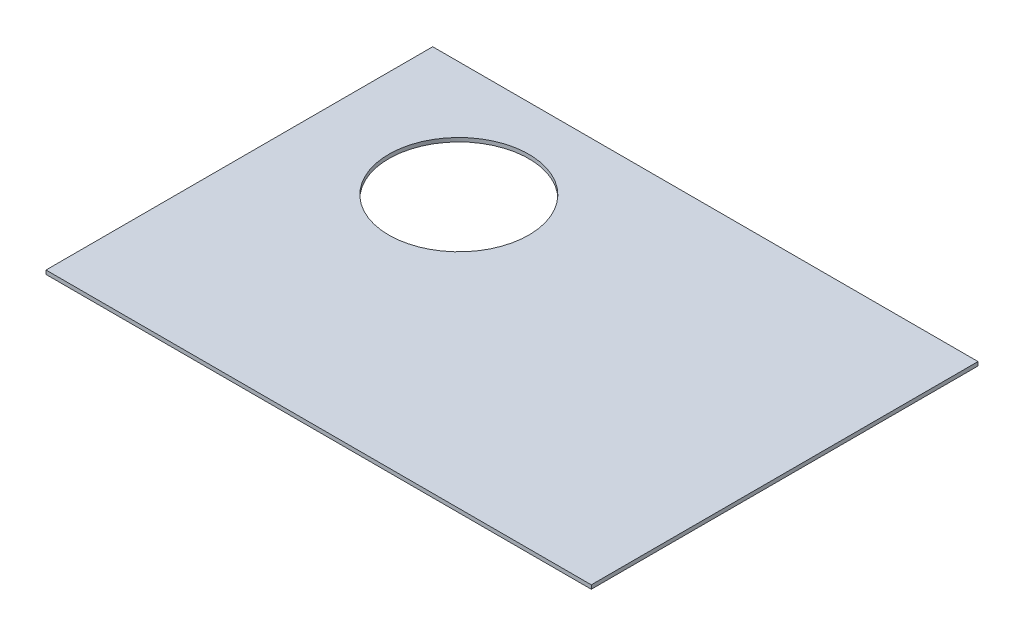
ISO-10303-21;
HEADER;
FILE_DESCRIPTION(('STEP AP214'),'2;1');
FILE_NAME('part.step','',(''),(''),'','','');
FILE_SCHEMA(('AUTOMOTIVE_DESIGN { 1 0 10303 214 1 1 1 1 }'));
ENDSEC;
DATA;
#1=APPLICATION_CONTEXT('core data for automotive mechanical design processes');
#2=APPLICATION_PROTOCOL_DEFINITION('international standard','automotive_design',2000,#1);
#3=PRODUCT_CONTEXT('',#1,'mechanical');
#4=PRODUCT('Part','Part','',(#3));
#5=PRODUCT_RELATED_PRODUCT_CATEGORY('part','',(#4));
#6=PRODUCT_DEFINITION_FORMATION('','',#4);
#7=PRODUCT_DEFINITION_CONTEXT('part definition',#1,'design');
#8=PRODUCT_DEFINITION('design','',#6,#7);
#9=PRODUCT_DEFINITION_SHAPE('','',#8);
#10=(LENGTH_UNIT() NAMED_UNIT(*) SI_UNIT(.MILLI.,.METRE.));
#11=(NAMED_UNIT(*) PLANE_ANGLE_UNIT() SI_UNIT($,.RADIAN.));
#12=(NAMED_UNIT(*) SI_UNIT($,.STERADIAN.) SOLID_ANGLE_UNIT());
#13=UNCERTAINTY_MEASURE_WITH_UNIT(LENGTH_MEASURE(1.E-05),#10,'distance_accuracy_value','');
#14=(GEOMETRIC_REPRESENTATION_CONTEXT(3) GLOBAL_UNCERTAINTY_ASSIGNED_CONTEXT((#13)) GLOBAL_UNIT_ASSIGNED_CONTEXT((#10,
#11,#12)) REPRESENTATION_CONTEXT('',''));
#15=CARTESIAN_POINT('',(0.,0.,0.));
#16=DIRECTION('',(0.,0.,1.));
#17=DIRECTION('',(1.,0.,0.));
#18=AXIS2_PLACEMENT_3D('',#15,#16,#17);
#19=CARTESIAN_POINT('',(0.,3.175,0.));
#20=DIRECTION('',(1.,0.,0.));
#21=DIRECTION('',(0.,0.,-1.));
#22=AXIS2_PLACEMENT_3D('',#19,#20,#21);
#23=PLANE('',#22);
#24=DIRECTION('',(0.,0.,1.));
#25=VECTOR('',#24,1.);
#26=CARTESIAN_POINT('',(0.,0.,0.));
#27=LINE('',#26,#25);
#28=CARTESIAN_POINT('',(0.,0.,-317.5));
#29=VERTEX_POINT('',#28);
#30=CARTESIAN_POINT('',(0.,0.,0.));
#31=VERTEX_POINT('',#30);
#32=EDGE_CURVE('E106',#29,#31,#27,.T.);
#33=ORIENTED_EDGE('',*,*,#32,.T.);
#34=DIRECTION('',(0.,-1.,0.));
#35=VECTOR('',#34,1.);
#36=CARTESIAN_POINT('',(0.,3.175,0.));
#37=LINE('',#36,#35);
#38=CARTESIAN_POINT('',(0.,3.175,0.));
#39=VERTEX_POINT('',#38);
#40=EDGE_CURVE('E11',#39,#31,#37,.T.);
#41=ORIENTED_EDGE('',*,*,#40,.F.);
#42=DIRECTION('',(0.,0.,1.));
#43=VECTOR('',#42,1.);
#44=CARTESIAN_POINT('',(0.,3.175,0.));
#45=LINE('',#44,#43);
#46=CARTESIAN_POINT('',(0.,3.175,-317.5));
#47=VERTEX_POINT('',#46);
#48=EDGE_CURVE('E95',#47,#39,#45,.T.);
#49=ORIENTED_EDGE('',*,*,#48,.F.);
#50=DIRECTION('',(0.,-1.,0.));
#51=VECTOR('',#50,1.);
#52=CARTESIAN_POINT('',(0.,3.175,-317.5));
#53=LINE('',#52,#51);
#54=EDGE_CURVE('E105',#47,#29,#53,.T.);
#55=ORIENTED_EDGE('',*,*,#54,.T.);
#56=EDGE_LOOP('',(#33,#41,#49,#55));
#57=FACE_BOUND('',#56,.T.);
#58=ADVANCED_FACE('F43',(#57),#23,.F.);
#59=CARTESIAN_POINT('',(401.6375,3.175,0.));
#60=DIRECTION('',(0.,0.,-1.));
#61=DIRECTION('',(-1.,0.,0.));
#62=AXIS2_PLACEMENT_3D('',#59,#60,#61);
#63=PLANE('',#62);
#64=DIRECTION('',(1.,0.,0.));
#65=VECTOR('',#64,1.);
#66=CARTESIAN_POINT('',(401.6375,0.,0.));
#67=LINE('',#66,#65);
#68=CARTESIAN_POINT('',(447.675,0.,0.));
#69=VERTEX_POINT('',#68);
#70=EDGE_CURVE('E96',#31,#69,#67,.T.);
#71=ORIENTED_EDGE('',*,*,#70,.T.);
#72=DIRECTION('',(0.,-1.,0.));
#73=VECTOR('',#72,1.);
#74=CARTESIAN_POINT('',(447.675,3.175,0.));
#75=LINE('',#74,#73);
#76=CARTESIAN_POINT('',(447.675,3.175,0.));
#77=VERTEX_POINT('',#76);
#78=EDGE_CURVE('E51',#77,#69,#75,.T.);
#79=ORIENTED_EDGE('',*,*,#78,.F.);
#80=DIRECTION('',(1.,0.,0.));
#81=VECTOR('',#80,1.);
#82=CARTESIAN_POINT('',(0.,3.175,0.));
#83=LINE('',#82,#81);
#84=EDGE_CURVE('E88',#39,#77,#83,.T.);
#85=ORIENTED_EDGE('',*,*,#84,.F.);
#86=ORIENTED_EDGE('',*,*,#40,.T.);
#87=EDGE_LOOP('',(#71,#79,#85,#86));
#88=FACE_BOUND('',#87,.T.);
#89=ADVANCED_FACE('F97',(#88),#63,.F.);
#90=CARTESIAN_POINT('',(447.675,3.175,0.));
#91=DIRECTION('',(-1.,0.,0.));
#92=DIRECTION('',(0.,0.,1.));
#93=AXIS2_PLACEMENT_3D('',#90,#91,#92);
#94=PLANE('',#93);
#95=DIRECTION('',(0.,0.,-1.));
#96=VECTOR('',#95,1.);
#97=CARTESIAN_POINT('',(447.675,0.,0.));
#98=LINE('',#97,#96);
#99=CARTESIAN_POINT('',(447.675,0.,-317.5));
#100=VERTEX_POINT('',#99);
#101=EDGE_CURVE('E77',#69,#100,#98,.T.);
#102=ORIENTED_EDGE('',*,*,#101,.T.);
#103=DIRECTION('',(0.,-1.,0.));
#104=VECTOR('',#103,1.);
#105=CARTESIAN_POINT('',(447.675,3.175,-317.5));
#106=LINE('',#105,#104);
#107=CARTESIAN_POINT('',(447.675,3.175,-317.5));
#108=VERTEX_POINT('',#107);
#109=EDGE_CURVE('E100',#108,#100,#106,.T.);
#110=ORIENTED_EDGE('',*,*,#109,.F.);
#111=DIRECTION('',(0.,0.,-1.));
#112=VECTOR('',#111,1.);
#113=CARTESIAN_POINT('',(447.675,3.175,0.));
#114=LINE('',#113,#112);
#115=EDGE_CURVE('E94',#77,#108,#114,.T.);
#116=ORIENTED_EDGE('',*,*,#115,.F.);
#117=ORIENTED_EDGE('',*,*,#78,.T.);
#118=EDGE_LOOP('',(#102,#110,#116,#117));
#119=FACE_BOUND('',#118,.T.);
#120=ADVANCED_FACE('F99',(#119),#94,.F.);
#121=CARTESIAN_POINT('',(0.,3.175,-317.5));
#122=DIRECTION('',(0.,0.,1.));
#123=DIRECTION('',(1.,0.,0.));
#124=AXIS2_PLACEMENT_3D('',#121,#122,#123);
#125=PLANE('',#124);
#126=DIRECTION('',(-1.,0.,0.));
#127=VECTOR('',#126,1.);
#128=CARTESIAN_POINT('',(0.,0.,-317.5));
#129=LINE('',#128,#127);
#130=EDGE_CURVE('E81',#100,#29,#129,.T.);
#131=ORIENTED_EDGE('',*,*,#130,.T.);
#132=ORIENTED_EDGE('',*,*,#54,.F.);
#133=DIRECTION('',(-1.,0.,0.));
#134=VECTOR('',#133,1.);
#135=CARTESIAN_POINT('',(0.,3.175,-317.5));
#136=LINE('',#135,#134);
#137=EDGE_CURVE('E56',#108,#47,#136,.T.);
#138=ORIENTED_EDGE('',*,*,#137,.F.);
#139=ORIENTED_EDGE('',*,*,#109,.T.);
#140=EDGE_LOOP('',(#131,#132,#138,#139));
#141=FACE_BOUND('',#140,.T.);
#142=ADVANCED_FACE('F112',(#141),#125,.F.);
#143=CARTESIAN_POINT('',(0.,3.175,0.));
#144=DIRECTION('',(0.,-1.,0.));
#145=DIRECTION('',(0.,0.,-1.));
#146=AXIS2_PLACEMENT_3D('',#143,#144,#145);
#147=PLANE('',#146);
#148=CARTESIAN_POINT('',(115.8875,3.175,-223.04375));
#149=DIRECTION('',(0.,1.,0.));
#150=DIRECTION('',(0.,0.,1.));
#151=AXIS2_PLACEMENT_3D('',#148,#149,#150);
#152=CIRCLE('',#151,57.5);
#153=CARTESIAN_POINT('',(115.8875,3.175,-165.54375));
#154=VERTEX_POINT('',#153);
#155=EDGE_CURVE('E119',#154,#154,#152,.T.);
#156=ORIENTED_EDGE('',*,*,#155,.F.);
#157=EDGE_LOOP('',(#156));
#158=FACE_BOUND('',#157,.T.);
#159=ORIENTED_EDGE('',*,*,#48,.T.);
#160=ORIENTED_EDGE('',*,*,#84,.T.);
#161=ORIENTED_EDGE('',*,*,#115,.T.);
#162=ORIENTED_EDGE('',*,*,#137,.T.);
#163=EDGE_LOOP('',(#159,#160,#161,#162));
#164=FACE_BOUND('',#163,.T.);
#165=ADVANCED_FACE('F87',(#158,#164),#147,.F.);
#166=CARTESIAN_POINT('',(0.,0.,0.));
#167=DIRECTION('',(0.,-1.,0.));
#168=DIRECTION('',(0.,0.,-1.));
#169=AXIS2_PLACEMENT_3D('',#166,#167,#168);
#170=PLANE('',#169);
#171=CARTESIAN_POINT('',(115.8875,0.,-223.04375));
#172=DIRECTION('',(0.,1.,0.));
#173=DIRECTION('',(0.,0.,1.));
#174=AXIS2_PLACEMENT_3D('',#171,#172,#173);
#175=CIRCLE('',#174,57.5);
#176=CARTESIAN_POINT('',(115.8875,0.,-165.54375));
#177=VERTEX_POINT('',#176);
#178=EDGE_CURVE('E107',#177,#177,#175,.T.);
#179=ORIENTED_EDGE('',*,*,#178,.T.);
#180=EDGE_LOOP('',(#179));
#181=FACE_BOUND('',#180,.T.);
#182=ORIENTED_EDGE('',*,*,#32,.F.);
#183=ORIENTED_EDGE('',*,*,#130,.F.);
#184=ORIENTED_EDGE('',*,*,#101,.F.);
#185=ORIENTED_EDGE('',*,*,#70,.F.);
#186=EDGE_LOOP('',(#182,#183,#184,#185));
#187=FACE_BOUND('',#186,.T.);
#188=ADVANCED_FACE('F120',(#181,#187),#170,.T.);
#189=CARTESIAN_POINT('',(115.8875,0.,-223.04375));
#190=DIRECTION('',(0.,1.,0.));
#191=DIRECTION('',(0.,0.,1.));
#192=AXIS2_PLACEMENT_3D('',#189,#190,#191);
#193=CYLINDRICAL_SURFACE('',#192,57.5);
#194=ORIENTED_EDGE('',*,*,#178,.F.);
#195=EDGE_LOOP('',(#194));
#196=FACE_BOUND('',#195,.T.);
#197=ORIENTED_EDGE('',*,*,#155,.T.);
#198=EDGE_LOOP('',(#197));
#199=FACE_BOUND('',#198,.T.);
#200=ADVANCED_FACE('F126',(#196,#199),#193,.F.);
#201=CLOSED_SHELL('',(#58,#89,#120,#142,#165,#188,#200));
#202=MANIFOLD_SOLID_BREP('B2',#201);
#203=ADVANCED_BREP_SHAPE_REPRESENTATION('',(#18,#202),#14);
#204=SHAPE_DEFINITION_REPRESENTATION(#9,#203);
ENDSEC;
END-ISO-10303-21;
